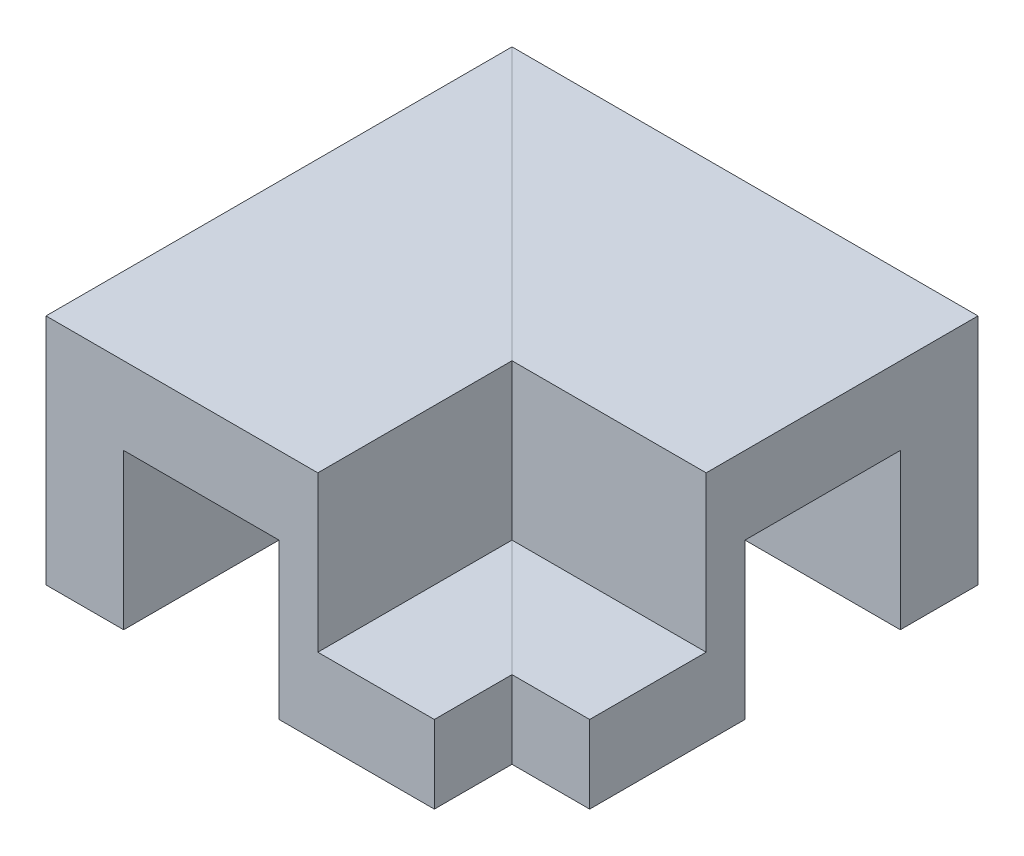
ISO-10303-21;
HEADER;
FILE_DESCRIPTION(('STEP AP214'),'2;1');
FILE_NAME('part.step','',(''),(''),'','','');
FILE_SCHEMA(('AUTOMOTIVE_DESIGN { 1 0 10303 214 1 1 1 1 }'));
ENDSEC;
DATA;
#1=APPLICATION_CONTEXT('core data for automotive mechanical design processes');
#2=APPLICATION_PROTOCOL_DEFINITION('international standard','automotive_design',2000,#1);
#3=PRODUCT_CONTEXT('',#1,'mechanical');
#4=PRODUCT('Part','Part','',(#3));
#5=PRODUCT_RELATED_PRODUCT_CATEGORY('part','',(#4));
#6=PRODUCT_DEFINITION_FORMATION('','',#4);
#7=PRODUCT_DEFINITION_CONTEXT('part definition',#1,'design');
#8=PRODUCT_DEFINITION('design','',#6,#7);
#9=PRODUCT_DEFINITION_SHAPE('','',#8);
#10=(LENGTH_UNIT() NAMED_UNIT(*) SI_UNIT(.MILLI.,.METRE.));
#11=(NAMED_UNIT(*) PLANE_ANGLE_UNIT() SI_UNIT($,.RADIAN.));
#12=(NAMED_UNIT(*) SI_UNIT($,.STERADIAN.) SOLID_ANGLE_UNIT());
#13=UNCERTAINTY_MEASURE_WITH_UNIT(LENGTH_MEASURE(1.E-05),#10,'distance_accuracy_value','');
#14=(GEOMETRIC_REPRESENTATION_CONTEXT(3) GLOBAL_UNCERTAINTY_ASSIGNED_CONTEXT((#13)) GLOBAL_UNIT_ASSIGNED_CONTEXT((#10,
#11,#12)) REPRESENTATION_CONTEXT('',''));
#15=CARTESIAN_POINT('',(0.,0.,0.));
#16=DIRECTION('',(0.,0.,1.));
#17=DIRECTION('',(1.,0.,0.));
#18=AXIS2_PLACEMENT_3D('',#15,#16,#17);
#19=CARTESIAN_POINT('',(0.,0.,19.05));
#20=DIRECTION('',(0.,0.,1.));
#21=DIRECTION('',(1.,0.,0.));
#22=AXIS2_PLACEMENT_3D('',#19,#20,#21);
#23=PLANE('',#22);
#24=DIRECTION('',(0.,-1.,0.));
#25=VECTOR('',#24,1.);
#26=CARTESIAN_POINT('',(0.,12.7,19.05));
#27=LINE('',#26,#25);
#28=CARTESIAN_POINT('',(0.,12.7,19.05));
#29=VERTEX_POINT('',#28);
#30=CARTESIAN_POINT('',(0.,0.,19.05));
#31=VERTEX_POINT('',#30);
#32=EDGE_CURVE('E90',#29,#31,#27,.T.);
#33=ORIENTED_EDGE('',*,*,#32,.T.);
#34=DIRECTION('',(1.,0.,0.));
#35=VECTOR('',#34,1.);
#36=CARTESIAN_POINT('',(0.,0.,19.05));
#37=LINE('',#36,#35);
#38=CARTESIAN_POINT('',(12.7,0.,19.05));
#39=VERTEX_POINT('',#38);
#40=EDGE_CURVE('E243',#31,#39,#37,.T.);
#41=ORIENTED_EDGE('',*,*,#40,.T.);
#42=DIRECTION('',(0.,1.,0.));
#43=VECTOR('',#42,1.);
#44=CARTESIAN_POINT('',(12.7,0.,19.05));
#45=LINE('',#44,#43);
#46=CARTESIAN_POINT('',(12.7,6.35,19.05));
#47=VERTEX_POINT('',#46);
#48=EDGE_CURVE('E241',#39,#47,#45,.T.);
#49=ORIENTED_EDGE('',*,*,#48,.T.);
#50=DIRECTION('',(-1.,0.,0.));
#51=VECTOR('',#50,1.);
#52=CARTESIAN_POINT('',(12.7,6.35,19.05));
#53=LINE('',#52,#51);
#54=CARTESIAN_POINT('',(3.175,6.35,19.05));
#55=VERTEX_POINT('',#54);
#56=EDGE_CURVE('E239',#47,#55,#53,.T.);
#57=ORIENTED_EDGE('',*,*,#56,.T.);
#58=DIRECTION('',(0.,1.,0.));
#59=VECTOR('',#58,1.);
#60=CARTESIAN_POINT('',(3.175,6.35,19.05));
#61=LINE('',#60,#59);
#62=CARTESIAN_POINT('',(3.175,19.05,19.05));
#63=VERTEX_POINT('',#62);
#64=EDGE_CURVE('E173',#55,#63,#61,.T.);
#65=ORIENTED_EDGE('',*,*,#64,.T.);
#66=DIRECTION('',(-1.,0.,0.));
#67=VECTOR('',#66,1.);
#68=CARTESIAN_POINT('',(3.175,19.05,19.05));
#69=LINE('',#68,#67);
#70=CARTESIAN_POINT('',(-19.05,19.05,19.05));
#71=VERTEX_POINT('',#70);
#72=EDGE_CURVE('E236',#63,#71,#69,.T.);
#73=ORIENTED_EDGE('',*,*,#72,.T.);
#74=DIRECTION('',(0.,-1.,0.));
#75=VECTOR('',#74,1.);
#76=CARTESIAN_POINT('',(-19.05,19.05,19.05));
#77=LINE('',#76,#75);
#78=CARTESIAN_POINT('',(-19.05,0.,19.05));
#79=VERTEX_POINT('',#78);
#80=EDGE_CURVE('E234',#71,#79,#77,.T.);
#81=ORIENTED_EDGE('',*,*,#80,.T.);
#82=DIRECTION('',(1.,0.,0.));
#83=VECTOR('',#82,1.);
#84=CARTESIAN_POINT('',(-19.05,0.,19.05));
#85=LINE('',#84,#83);
#86=CARTESIAN_POINT('',(-12.7,0.,19.05));
#87=VERTEX_POINT('',#86);
#88=EDGE_CURVE('E232',#79,#87,#85,.T.);
#89=ORIENTED_EDGE('',*,*,#88,.T.);
#90=DIRECTION('',(0.,1.,0.));
#91=VECTOR('',#90,1.);
#92=CARTESIAN_POINT('',(-12.7,0.,19.05));
#93=LINE('',#92,#91);
#94=CARTESIAN_POINT('',(-12.7,12.7,19.05));
#95=VERTEX_POINT('',#94);
#96=EDGE_CURVE('E230',#87,#95,#93,.T.);
#97=ORIENTED_EDGE('',*,*,#96,.T.);
#98=DIRECTION('',(1.,0.,0.));
#99=VECTOR('',#98,1.);
#100=CARTESIAN_POINT('',(-12.7,12.7,19.05));
#101=LINE('',#100,#99);
#102=EDGE_CURVE('E94',#95,#29,#101,.T.);
#103=ORIENTED_EDGE('',*,*,#102,.T.);
#104=EDGE_LOOP('',(#33,#41,#49,#57,#65,#73,#81,#89,#97,#103));
#105=FACE_BOUND('',#104,.T.);
#106=ADVANCED_FACE('F39',(#105),#23,.T.);
#107=CARTESIAN_POINT('',(19.05,0.,0.));
#108=DIRECTION('',(-1.,0.,0.));
#109=DIRECTION('',(0.,0.,1.));
#110=AXIS2_PLACEMENT_3D('',#107,#108,#109);
#111=PLANE('',#110);
#112=DIRECTION('',(0.,-1.,0.));
#113=VECTOR('',#112,1.);
#114=CARTESIAN_POINT('',(19.05,12.7,0.));
#115=LINE('',#114,#113);
#116=CARTESIAN_POINT('',(19.05,12.7,0.));
#117=VERTEX_POINT('',#116);
#118=CARTESIAN_POINT('',(19.05,0.,0.));
#119=VERTEX_POINT('',#118);
#120=EDGE_CURVE('E102',#117,#119,#115,.T.);
#121=ORIENTED_EDGE('',*,*,#120,.F.);
#122=DIRECTION('',(0.,0.,1.));
#123=VECTOR('',#122,1.);
#124=CARTESIAN_POINT('',(19.05,12.7,-12.7));
#125=LINE('',#124,#123);
#126=CARTESIAN_POINT('',(19.05,12.7,-12.7));
#127=VERTEX_POINT('',#126);
#128=EDGE_CURVE('E220',#127,#117,#125,.T.);
#129=ORIENTED_EDGE('',*,*,#128,.F.);
#130=DIRECTION('',(0.,1.,0.));
#131=VECTOR('',#130,1.);
#132=CARTESIAN_POINT('',(19.05,0.,-12.7));
#133=LINE('',#132,#131);
#134=CARTESIAN_POINT('',(19.05,0.,-12.7));
#135=VERTEX_POINT('',#134);
#136=EDGE_CURVE('E214',#135,#127,#133,.T.);
#137=ORIENTED_EDGE('',*,*,#136,.F.);
#138=DIRECTION('',(0.,0.,1.));
#139=VECTOR('',#138,1.);
#140=CARTESIAN_POINT('',(19.05,0.,-19.05));
#141=LINE('',#140,#139);
#142=CARTESIAN_POINT('',(19.05,0.,-19.05));
#143=VERTEX_POINT('',#142);
#144=EDGE_CURVE('E208',#143,#135,#141,.T.);
#145=ORIENTED_EDGE('',*,*,#144,.F.);
#146=DIRECTION('',(0.,-1.,0.));
#147=VECTOR('',#146,1.);
#148=CARTESIAN_POINT('',(19.05,19.05,-19.05));
#149=LINE('',#148,#147);
#150=CARTESIAN_POINT('',(19.05,19.05,-19.05));
#151=VERTEX_POINT('',#150);
#152=EDGE_CURVE('E202',#151,#143,#149,.T.);
#153=ORIENTED_EDGE('',*,*,#152,.F.);
#154=DIRECTION('',(0.,0.,-1.));
#155=VECTOR('',#154,1.);
#156=CARTESIAN_POINT('',(19.05,19.05,3.17500000000005));
#157=LINE('',#156,#155);
#158=CARTESIAN_POINT('',(19.05,19.05,3.17500000000005));
#159=VERTEX_POINT('',#158);
#160=EDGE_CURVE('E198',#159,#151,#157,.T.);
#161=ORIENTED_EDGE('',*,*,#160,.F.);
#162=DIRECTION('',(0.,1.,0.));
#163=VECTOR('',#162,1.);
#164=CARTESIAN_POINT('',(19.05,6.35,3.17500000000005));
#165=LINE('',#164,#163);
#166=CARTESIAN_POINT('',(19.05,6.35,3.17500000000005));
#167=VERTEX_POINT('',#166);
#168=EDGE_CURVE('E197',#167,#159,#165,.T.);
#169=ORIENTED_EDGE('',*,*,#168,.F.);
#170=DIRECTION('',(0.,0.,-1.));
#171=VECTOR('',#170,1.);
#172=CARTESIAN_POINT('',(19.05,6.35,12.7));
#173=LINE('',#172,#171);
#174=CARTESIAN_POINT('',(19.05,6.35,12.7));
#175=VERTEX_POINT('',#174);
#176=EDGE_CURVE('E188',#175,#167,#173,.T.);
#177=ORIENTED_EDGE('',*,*,#176,.F.);
#178=DIRECTION('',(0.,1.,0.));
#179=VECTOR('',#178,1.);
#180=CARTESIAN_POINT('',(19.05,0.,12.7));
#181=LINE('',#180,#179);
#182=CARTESIAN_POINT('',(19.05,0.,12.7));
#183=VERTEX_POINT('',#182);
#184=EDGE_CURVE('E274',#183,#175,#181,.T.);
#185=ORIENTED_EDGE('',*,*,#184,.F.);
#186=DIRECTION('',(0.,0.,1.));
#187=VECTOR('',#186,1.);
#188=CARTESIAN_POINT('',(19.05,0.,0.));
#189=LINE('',#188,#187);
#190=EDGE_CURVE('E267',#119,#183,#189,.T.);
#191=ORIENTED_EDGE('',*,*,#190,.F.);
#192=EDGE_LOOP('',(#121,#129,#137,#145,#153,#161,#169,#177,#185,#191));
#193=FACE_BOUND('',#192,.T.);
#194=ADVANCED_FACE('F290',(#193),#111,.F.);
#195=CARTESIAN_POINT('',(1.09560763785905E-13,12.7,-21.0549999999999));
#196=DIRECTION('',(-1.,0.,0.));
#197=DIRECTION('',(0.,0.,1.));
#198=AXIS2_PLACEMENT_3D('',#195,#196,#197);
#199=PLANE('',#198);
#200=DIRECTION('',(0.,1.,0.));
#201=VECTOR('',#200,1.);
#202=CARTESIAN_POINT('',(0.,12.7,0.));
#203=LINE('',#202,#201);
#204=CARTESIAN_POINT('',(0.,0.,0.));
#205=VERTEX_POINT('',#204);
#206=CARTESIAN_POINT('',(0.,12.7,0.));
#207=VERTEX_POINT('',#206);
#208=EDGE_CURVE('E223',#205,#207,#203,.T.);
#209=ORIENTED_EDGE('',*,*,#208,.F.);
#210=DIRECTION('',(0.,0.,1.));
#211=VECTOR('',#210,1.);
#212=CARTESIAN_POINT('',(1.09560763785905E-13,0.,-21.0549999999999));
#213=LINE('',#212,#211);
#214=EDGE_CURVE('E261',#205,#31,#213,.T.);
#215=ORIENTED_EDGE('',*,*,#214,.T.);
#216=ORIENTED_EDGE('',*,*,#32,.F.);
#217=DIRECTION('',(0.,0.,1.));
#218=VECTOR('',#217,1.);
#219=CARTESIAN_POINT('',(1.09560763785905E-13,12.7,-21.0549999999999));
#220=LINE('',#219,#218);
#221=EDGE_CURVE('E42',#207,#29,#220,.T.);
#222=ORIENTED_EDGE('',*,*,#221,.F.);
#223=EDGE_LOOP('',(#209,#215,#216,#222));
#224=FACE_BOUND('',#223,.T.);
#225=ADVANCED_FACE('F341',(#224),#199,.T.);
#226=CARTESIAN_POINT('',(1.09560763785905E-13,0.,-21.0549999999999));
#227=DIRECTION('',(0.,-1.,0.));
#228=DIRECTION('',(0.,0.,-1.));
#229=AXIS2_PLACEMENT_3D('',#226,#227,#228);
#230=PLANE('',#229);
#231=DIRECTION('',(-0.707106781186547,0.,-0.707106781186548));
#232=VECTOR('',#231,1.);
#233=CARTESIAN_POINT('',(9.525,0.,9.52500000000003));
#234=LINE('',#233,#232);
#235=CARTESIAN_POINT('',(12.7,0.,12.7000000000001));
#236=VERTEX_POINT('',#235);
#237=EDGE_CURVE('E11',#236,#205,#234,.T.);
#238=ORIENTED_EDGE('',*,*,#237,.F.);
#239=DIRECTION('',(0.,0.,1.));
#240=VECTOR('',#239,1.);
#241=CARTESIAN_POINT('',(12.7000000000001,0.,-21.0549999999999));
#242=LINE('',#241,#240);
#243=EDGE_CURVE('E260',#236,#39,#242,.T.);
#244=ORIENTED_EDGE('',*,*,#243,.T.);
#245=ORIENTED_EDGE('',*,*,#40,.F.);
#246=ORIENTED_EDGE('',*,*,#214,.F.);
#247=EDGE_LOOP('',(#238,#244,#245,#246));
#248=FACE_BOUND('',#247,.T.);
#249=ADVANCED_FACE('F325',(#248),#230,.T.);
#250=CARTESIAN_POINT('',(12.7000000000001,0.,-21.0549999999999));
#251=DIRECTION('',(1.,0.,0.));
#252=DIRECTION('',(0.,0.,-1.));
#253=AXIS2_PLACEMENT_3D('',#250,#251,#252);
#254=PLANE('',#253);
#255=DIRECTION('',(0.,-1.,0.));
#256=VECTOR('',#255,1.);
#257=CARTESIAN_POINT('',(12.7,0.,12.7));
#258=LINE('',#257,#256);
#259=CARTESIAN_POINT('',(12.7,6.35,12.7));
#260=VERTEX_POINT('',#259);
#261=EDGE_CURVE('E48',#260,#236,#258,.T.);
#262=ORIENTED_EDGE('',*,*,#261,.F.);
#263=DIRECTION('',(0.,0.,1.));
#264=VECTOR('',#263,1.);
#265=CARTESIAN_POINT('',(12.7000000000001,6.35,-21.0549999999999));
#266=LINE('',#265,#264);
#267=EDGE_CURVE('E160',#260,#47,#266,.T.);
#268=ORIENTED_EDGE('',*,*,#267,.T.);
#269=ORIENTED_EDGE('',*,*,#48,.F.);
#270=ORIENTED_EDGE('',*,*,#243,.F.);
#271=EDGE_LOOP('',(#262,#268,#269,#270));
#272=FACE_BOUND('',#271,.T.);
#273=ADVANCED_FACE('F323',(#272),#254,.T.);
#274=CARTESIAN_POINT('',(12.7000000000001,6.35,-21.0549999999999));
#275=DIRECTION('',(0.,1.,0.));
#276=DIRECTION('',(-1.,0.,0.));
#277=AXIS2_PLACEMENT_3D('',#274,#275,#276);
#278=PLANE('',#277);
#279=DIRECTION('',(0.707106781186547,0.,0.707106781186548));
#280=VECTOR('',#279,1.);
#281=CARTESIAN_POINT('',(15.875,6.35,15.8750000000001));
#282=LINE('',#281,#280);
#283=CARTESIAN_POINT('',(3.17500000000004,6.35,3.17500000000005));
#284=VERTEX_POINT('',#283);
#285=EDGE_CURVE('E154',#284,#260,#282,.T.);
#286=ORIENTED_EDGE('',*,*,#285,.F.);
#287=DIRECTION('',(0.,0.,1.));
#288=VECTOR('',#287,1.);
#289=CARTESIAN_POINT('',(3.17500000000011,6.35,-21.0549999999999));
#290=LINE('',#289,#288);
#291=EDGE_CURVE('E158',#284,#55,#290,.T.);
#292=ORIENTED_EDGE('',*,*,#291,.T.);
#293=ORIENTED_EDGE('',*,*,#56,.F.);
#294=ORIENTED_EDGE('',*,*,#267,.F.);
#295=EDGE_LOOP('',(#286,#292,#293,#294));
#296=FACE_BOUND('',#295,.T.);
#297=ADVANCED_FACE('F156',(#296),#278,.T.);
#298=CARTESIAN_POINT('',(3.17500000000011,6.35,-21.0549999999999));
#299=DIRECTION('',(1.,0.,0.));
#300=DIRECTION('',(0.,0.,-1.));
#301=AXIS2_PLACEMENT_3D('',#298,#299,#300);
#302=PLANE('',#301);
#303=DIRECTION('',(0.,-1.,0.));
#304=VECTOR('',#303,1.);
#305=CARTESIAN_POINT('',(3.17500000000004,6.35,3.17500000000005));
#306=LINE('',#305,#304);
#307=CARTESIAN_POINT('',(3.17500000000004,19.05,3.17500000000005));
#308=VERTEX_POINT('',#307);
#309=EDGE_CURVE('E165',#308,#284,#306,.T.);
#310=ORIENTED_EDGE('',*,*,#309,.F.);
#311=DIRECTION('',(0.,0.,1.));
#312=VECTOR('',#311,1.);
#313=CARTESIAN_POINT('',(3.17500000000011,19.05,-21.0549999999999));
#314=LINE('',#313,#312);
#315=EDGE_CURVE('E174',#308,#63,#314,.T.);
#316=ORIENTED_EDGE('',*,*,#315,.T.);
#317=ORIENTED_EDGE('',*,*,#64,.F.);
#318=ORIENTED_EDGE('',*,*,#291,.F.);
#319=EDGE_LOOP('',(#310,#316,#317,#318));
#320=FACE_BOUND('',#319,.T.);
#321=ADVANCED_FACE('F170',(#320),#302,.T.);
#322=CARTESIAN_POINT('',(3.17500000000011,19.05,-21.0549999999999));
#323=DIRECTION('',(0.,1.,0.));
#324=DIRECTION('',(0.,0.,1.));
#325=AXIS2_PLACEMENT_3D('',#322,#323,#324);
#326=PLANE('',#325);
#327=DIRECTION('',(0.707106781186547,0.,0.707106781186548));
#328=VECTOR('',#327,1.);
#329=CARTESIAN_POINT('',(11.1125,19.05,11.1125));
#330=LINE('',#329,#328);
#331=CARTESIAN_POINT('',(-19.0499999999999,19.05,-19.05));
#332=VERTEX_POINT('',#331);
#333=EDGE_CURVE('E184',#332,#308,#330,.T.);
#334=ORIENTED_EDGE('',*,*,#333,.F.);
#335=DIRECTION('',(0.,0.,1.));
#336=VECTOR('',#335,1.);
#337=CARTESIAN_POINT('',(-19.0499999999999,19.05,-21.0549999999999));
#338=LINE('',#337,#336);
#339=EDGE_CURVE('E255',#332,#71,#338,.T.);
#340=ORIENTED_EDGE('',*,*,#339,.T.);
#341=ORIENTED_EDGE('',*,*,#72,.F.);
#342=ORIENTED_EDGE('',*,*,#315,.F.);
#343=EDGE_LOOP('',(#334,#340,#341,#342));
#344=FACE_BOUND('',#343,.T.);
#345=ADVANCED_FACE('F328',(#344),#326,.T.);
#346=CARTESIAN_POINT('',(-19.0499999999999,19.05,-21.0549999999999));
#347=DIRECTION('',(-1.,0.,0.));
#348=DIRECTION('',(0.,0.,1.));
#349=AXIS2_PLACEMENT_3D('',#346,#347,#348);
#350=PLANE('',#349);
#351=DIRECTION('',(0.,1.,0.));
#352=VECTOR('',#351,1.);
#353=CARTESIAN_POINT('',(-19.0499999999999,19.05,-19.05));
#354=LINE('',#353,#352);
#355=CARTESIAN_POINT('',(-19.0499999999999,0.,-19.0499999999999));
#356=VERTEX_POINT('',#355);
#357=EDGE_CURVE('E312',#356,#332,#354,.T.);
#358=ORIENTED_EDGE('',*,*,#357,.F.);
#359=DIRECTION('',(0.,0.,1.));
#360=VECTOR('',#359,1.);
#361=CARTESIAN_POINT('',(-19.0499999999999,0.,-21.0549999999999));
#362=LINE('',#361,#360);
#363=EDGE_CURVE('E252',#356,#79,#362,.T.);
#364=ORIENTED_EDGE('',*,*,#363,.T.);
#365=ORIENTED_EDGE('',*,*,#80,.F.);
#366=ORIENTED_EDGE('',*,*,#339,.F.);
#367=EDGE_LOOP('',(#358,#364,#365,#366));
#368=FACE_BOUND('',#367,.T.);
#369=ADVANCED_FACE('F330',(#368),#350,.T.);
#370=CARTESIAN_POINT('',(-19.0499999999999,0.,-21.0549999999999));
#371=DIRECTION('',(0.,-1.,0.));
#372=DIRECTION('',(0.,0.,-1.));
#373=AXIS2_PLACEMENT_3D('',#370,#371,#372);
#374=PLANE('',#373);
#375=DIRECTION('',(-0.707106781186547,0.,-0.707106781186548));
#376=VECTOR('',#375,1.);
#377=CARTESIAN_POINT('',(0.,0.,0.));
#378=LINE('',#377,#376);
#379=CARTESIAN_POINT('',(-12.6999999999999,0.,-12.6999999999999));
#380=VERTEX_POINT('',#379);
#381=EDGE_CURVE('E307',#380,#356,#378,.T.);
#382=ORIENTED_EDGE('',*,*,#381,.F.);
#383=DIRECTION('',(0.,0.,1.));
#384=VECTOR('',#383,1.);
#385=CARTESIAN_POINT('',(-12.6999999999999,0.,-21.0549999999999));
#386=LINE('',#385,#384);
#387=EDGE_CURVE('E249',#380,#87,#386,.T.);
#388=ORIENTED_EDGE('',*,*,#387,.T.);
#389=ORIENTED_EDGE('',*,*,#88,.F.);
#390=ORIENTED_EDGE('',*,*,#363,.F.);
#391=EDGE_LOOP('',(#382,#388,#389,#390));
#392=FACE_BOUND('',#391,.T.);
#393=ADVANCED_FACE('F335',(#392),#374,.T.);
#394=CARTESIAN_POINT('',(-12.6999999999999,0.,-21.0549999999999));
#395=DIRECTION('',(1.,0.,0.));
#396=DIRECTION('',(0.,0.,-1.));
#397=AXIS2_PLACEMENT_3D('',#394,#395,#396);
#398=PLANE('',#397);
#399=DIRECTION('',(0.,-1.,0.));
#400=VECTOR('',#399,1.);
#401=CARTESIAN_POINT('',(-12.6999999999999,0.,-12.7));
#402=LINE('',#401,#400);
#403=CARTESIAN_POINT('',(-12.6999999999999,12.7,-12.7));
#404=VERTEX_POINT('',#403);
#405=EDGE_CURVE('E302',#404,#380,#402,.T.);
#406=ORIENTED_EDGE('',*,*,#405,.F.);
#407=DIRECTION('',(0.,0.,1.));
#408=VECTOR('',#407,1.);
#409=CARTESIAN_POINT('',(-12.6999999999999,12.7,-21.0549999999999));
#410=LINE('',#409,#408);
#411=EDGE_CURVE('E246',#404,#95,#410,.T.);
#412=ORIENTED_EDGE('',*,*,#411,.T.);
#413=ORIENTED_EDGE('',*,*,#96,.F.);
#414=ORIENTED_EDGE('',*,*,#387,.F.);
#415=EDGE_LOOP('',(#406,#412,#413,#414));
#416=FACE_BOUND('',#415,.T.);
#417=ADVANCED_FACE('F338',(#416),#398,.T.);
#418=CARTESIAN_POINT('',(-12.6999999999999,12.7,-21.0549999999999));
#419=DIRECTION('',(0.,-1.,0.));
#420=DIRECTION('',(0.,0.,-1.));
#421=AXIS2_PLACEMENT_3D('',#418,#419,#420);
#422=PLANE('',#421);
#423=DIRECTION('',(-0.707106781186547,0.,-0.707106781186548));
#424=VECTOR('',#423,1.);
#425=CARTESIAN_POINT('',(3.17499999999999,12.7,3.17499999999999));
#426=LINE('',#425,#424);
#427=EDGE_CURVE('E228',#207,#404,#426,.T.);
#428=ORIENTED_EDGE('',*,*,#427,.F.);
#429=ORIENTED_EDGE('',*,*,#221,.T.);
#430=ORIENTED_EDGE('',*,*,#102,.F.);
#431=ORIENTED_EDGE('',*,*,#411,.F.);
#432=EDGE_LOOP('',(#428,#429,#430,#431));
#433=FACE_BOUND('',#432,.T.);
#434=ADVANCED_FACE('F340',(#433),#422,.T.);
#435=CARTESIAN_POINT('',(19.05,12.7,-12.7));
#436=DIRECTION('',(0.,-1.,0.));
#437=DIRECTION('',(0.,0.,-1.));
#438=AXIS2_PLACEMENT_3D('',#435,#436,#437);
#439=PLANE('',#438);
#440=DIRECTION('',(-1.,0.,0.));
#441=VECTOR('',#440,1.);
#442=CARTESIAN_POINT('',(19.05,12.7,0.));
#443=LINE('',#442,#441);
#444=EDGE_CURVE('E225',#117,#207,#443,.T.);
#445=ORIENTED_EDGE('',*,*,#444,.T.);
#446=ORIENTED_EDGE('',*,*,#427,.T.);
#447=DIRECTION('',(-1.,0.,0.));
#448=VECTOR('',#447,1.);
#449=CARTESIAN_POINT('',(19.05,12.7,-12.7));
#450=LINE('',#449,#448);
#451=EDGE_CURVE('E217',#127,#404,#450,.T.);
#452=ORIENTED_EDGE('',*,*,#451,.F.);
#453=ORIENTED_EDGE('',*,*,#128,.T.);
#454=EDGE_LOOP('',(#445,#446,#452,#453));
#455=FACE_BOUND('',#454,.T.);
#456=ADVANCED_FACE('F296',(#455),#439,.T.);
#457=CARTESIAN_POINT('',(19.05,0.,-12.7));
#458=DIRECTION('',(0.,0.,1.));
#459=DIRECTION('',(1.,0.,0.));
#460=AXIS2_PLACEMENT_3D('',#457,#458,#459);
#461=PLANE('',#460);
#462=ORIENTED_EDGE('',*,*,#451,.T.);
#463=ORIENTED_EDGE('',*,*,#405,.T.);
#464=DIRECTION('',(-1.,0.,0.));
#465=VECTOR('',#464,1.);
#466=CARTESIAN_POINT('',(19.05,0.,-12.7));
#467=LINE('',#466,#465);
#468=EDGE_CURVE('E211',#135,#380,#467,.T.);
#469=ORIENTED_EDGE('',*,*,#468,.F.);
#470=ORIENTED_EDGE('',*,*,#136,.T.);
#471=EDGE_LOOP('',(#462,#463,#469,#470));
#472=FACE_BOUND('',#471,.T.);
#473=ADVANCED_FACE('F300',(#472),#461,.T.);
#474=CARTESIAN_POINT('',(19.05,0.,-19.05));
#475=DIRECTION('',(0.,-1.,0.));
#476=DIRECTION('',(0.,0.,-1.));
#477=AXIS2_PLACEMENT_3D('',#474,#475,#476);
#478=PLANE('',#477);
#479=ORIENTED_EDGE('',*,*,#468,.T.);
#480=ORIENTED_EDGE('',*,*,#381,.T.);
#481=DIRECTION('',(-1.,0.,0.));
#482=VECTOR('',#481,1.);
#483=CARTESIAN_POINT('',(19.05,0.,-19.05));
#484=LINE('',#483,#482);
#485=EDGE_CURVE('E205',#143,#356,#484,.T.);
#486=ORIENTED_EDGE('',*,*,#485,.F.);
#487=ORIENTED_EDGE('',*,*,#144,.T.);
#488=EDGE_LOOP('',(#479,#480,#486,#487));
#489=FACE_BOUND('',#488,.T.);
#490=ADVANCED_FACE('F305',(#489),#478,.T.);
#491=CARTESIAN_POINT('',(19.05,19.05,-19.05));
#492=DIRECTION('',(0.,0.,-1.));
#493=DIRECTION('',(0.,1.,0.));
#494=AXIS2_PLACEMENT_3D('',#491,#492,#493);
#495=PLANE('',#494);
#496=ORIENTED_EDGE('',*,*,#485,.T.);
#497=ORIENTED_EDGE('',*,*,#357,.T.);
#498=DIRECTION('',(-1.,0.,0.));
#499=VECTOR('',#498,1.);
#500=CARTESIAN_POINT('',(19.05,19.05,-19.05));
#501=LINE('',#500,#499);
#502=EDGE_CURVE('E191',#151,#332,#501,.T.);
#503=ORIENTED_EDGE('',*,*,#502,.F.);
#504=ORIENTED_EDGE('',*,*,#152,.T.);
#505=EDGE_LOOP('',(#496,#497,#503,#504));
#506=FACE_BOUND('',#505,.T.);
#507=ADVANCED_FACE('F310',(#506),#495,.T.);
#508=CARTESIAN_POINT('',(19.05,19.05,3.17500000000005));
#509=DIRECTION('',(0.,1.,0.));
#510=DIRECTION('',(0.,0.,1.));
#511=AXIS2_PLACEMENT_3D('',#508,#509,#510);
#512=PLANE('',#511);
#513=ORIENTED_EDGE('',*,*,#502,.T.);
#514=ORIENTED_EDGE('',*,*,#333,.T.);
#515=DIRECTION('',(-1.,0.,0.));
#516=VECTOR('',#515,1.);
#517=CARTESIAN_POINT('',(19.05,19.05,3.17500000000005));
#518=LINE('',#517,#516);
#519=EDGE_CURVE('E183',#159,#308,#518,.T.);
#520=ORIENTED_EDGE('',*,*,#519,.F.);
#521=ORIENTED_EDGE('',*,*,#160,.T.);
#522=EDGE_LOOP('',(#513,#514,#520,#521));
#523=FACE_BOUND('',#522,.T.);
#524=ADVANCED_FACE('F315',(#523),#512,.T.);
#525=CARTESIAN_POINT('',(19.05,6.35,3.17500000000005));
#526=DIRECTION('',(0.,0.,1.));
#527=DIRECTION('',(1.,0.,0.));
#528=AXIS2_PLACEMENT_3D('',#525,#526,#527);
#529=PLANE('',#528);
#530=ORIENTED_EDGE('',*,*,#519,.T.);
#531=ORIENTED_EDGE('',*,*,#309,.T.);
#532=DIRECTION('',(-1.,0.,0.));
#533=VECTOR('',#532,1.);
#534=CARTESIAN_POINT('',(19.05,6.35,3.17500000000005));
#535=LINE('',#534,#533);
#536=EDGE_CURVE('E181',#167,#284,#535,.T.);
#537=ORIENTED_EDGE('',*,*,#536,.F.);
#538=ORIENTED_EDGE('',*,*,#168,.T.);
#539=EDGE_LOOP('',(#530,#531,#537,#538));
#540=FACE_BOUND('',#539,.T.);
#541=ADVANCED_FACE('F179',(#540),#529,.T.);
#542=CARTESIAN_POINT('',(19.05,6.35,12.7));
#543=DIRECTION('',(0.,1.,0.));
#544=DIRECTION('',(0.,0.,1.));
#545=AXIS2_PLACEMENT_3D('',#542,#543,#544);
#546=PLANE('',#545);
#547=ORIENTED_EDGE('',*,*,#536,.T.);
#548=ORIENTED_EDGE('',*,*,#285,.T.);
#549=DIRECTION('',(-1.,0.,0.));
#550=VECTOR('',#549,1.);
#551=CARTESIAN_POINT('',(19.05,6.35,12.7));
#552=LINE('',#551,#550);
#553=EDGE_CURVE('E189',#175,#260,#552,.T.);
#554=ORIENTED_EDGE('',*,*,#553,.F.);
#555=ORIENTED_EDGE('',*,*,#176,.T.);
#556=EDGE_LOOP('',(#547,#548,#554,#555));
#557=FACE_BOUND('',#556,.T.);
#558=ADVANCED_FACE('F187',(#557),#546,.T.);
#559=CARTESIAN_POINT('',(19.05,0.,12.7));
#560=DIRECTION('',(0.,0.,1.));
#561=DIRECTION('',(0.,-1.,0.));
#562=AXIS2_PLACEMENT_3D('',#559,#560,#561);
#563=PLANE('',#562);
#564=ORIENTED_EDGE('',*,*,#553,.T.);
#565=ORIENTED_EDGE('',*,*,#261,.T.);
#566=DIRECTION('',(-1.,0.,0.));
#567=VECTOR('',#566,1.);
#568=CARTESIAN_POINT('',(19.05,0.,12.7));
#569=LINE('',#568,#567);
#570=EDGE_CURVE('E193',#183,#236,#569,.T.);
#571=ORIENTED_EDGE('',*,*,#570,.F.);
#572=ORIENTED_EDGE('',*,*,#184,.T.);
#573=EDGE_LOOP('',(#564,#565,#571,#572));
#574=FACE_BOUND('',#573,.T.);
#575=ADVANCED_FACE('F288',(#574),#563,.T.);
#576=CARTESIAN_POINT('',(19.05,0.,0.));
#577=DIRECTION('',(0.,-1.,0.));
#578=DIRECTION('',(0.,0.,-1.));
#579=AXIS2_PLACEMENT_3D('',#576,#577,#578);
#580=PLANE('',#579);
#581=ORIENTED_EDGE('',*,*,#570,.T.);
#582=ORIENTED_EDGE('',*,*,#237,.T.);
#583=DIRECTION('',(-1.,0.,0.));
#584=VECTOR('',#583,1.);
#585=CARTESIAN_POINT('',(19.05,0.,0.));
#586=LINE('',#585,#584);
#587=EDGE_CURVE('E279',#119,#205,#586,.T.);
#588=ORIENTED_EDGE('',*,*,#587,.F.);
#589=ORIENTED_EDGE('',*,*,#190,.T.);
#590=EDGE_LOOP('',(#581,#582,#588,#589));
#591=FACE_BOUND('',#590,.T.);
#592=ADVANCED_FACE('F292',(#591),#580,.T.);
#593=CARTESIAN_POINT('',(19.05,12.7,0.));
#594=DIRECTION('',(0.,0.,-1.));
#595=DIRECTION('',(-1.,0.,0.));
#596=AXIS2_PLACEMENT_3D('',#593,#594,#595);
#597=PLANE('',#596);
#598=ORIENTED_EDGE('',*,*,#587,.T.);
#599=ORIENTED_EDGE('',*,*,#208,.T.);
#600=ORIENTED_EDGE('',*,*,#444,.F.);
#601=ORIENTED_EDGE('',*,*,#120,.T.);
#602=EDGE_LOOP('',(#598,#599,#600,#601));
#603=FACE_BOUND('',#602,.T.);
#604=ADVANCED_FACE('F293',(#603),#597,.T.);
#605=CLOSED_SHELL('',(#106,#194,#225,#249,#273,#297,#321,#345,#369,#393,#417,#434,#456,#473,
#490,#507,#524,#541,#558,#575,#592,#604));
#606=MANIFOLD_SOLID_BREP('B2',#605);
#607=ADVANCED_BREP_SHAPE_REPRESENTATION('',(#18,#606),#14);
#608=SHAPE_DEFINITION_REPRESENTATION(#9,#607);
ENDSEC;
END-ISO-10303-21;
